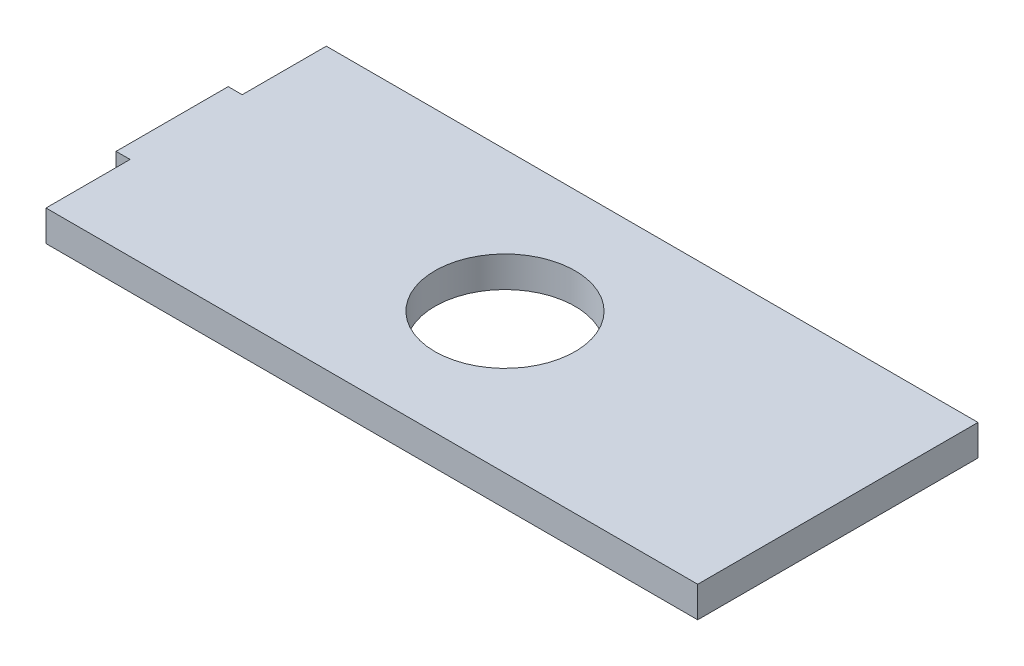
ISO-10303-21;
HEADER;
FILE_DESCRIPTION(('STEP AP214'),'2;1');
FILE_NAME('part.step','',(''),(''),'','','');
FILE_SCHEMA(('AUTOMOTIVE_DESIGN { 1 0 10303 214 1 1 1 1 }'));
ENDSEC;
DATA;
#1=APPLICATION_CONTEXT('core data for automotive mechanical design processes');
#2=APPLICATION_PROTOCOL_DEFINITION('international standard','automotive_design',2000,#1);
#3=PRODUCT_CONTEXT('',#1,'mechanical');
#4=PRODUCT('Part','Part','',(#3));
#5=PRODUCT_RELATED_PRODUCT_CATEGORY('part','',(#4));
#6=PRODUCT_DEFINITION_FORMATION('','',#4);
#7=PRODUCT_DEFINITION_CONTEXT('part definition',#1,'design');
#8=PRODUCT_DEFINITION('design','',#6,#7);
#9=PRODUCT_DEFINITION_SHAPE('','',#8);
#10=(LENGTH_UNIT() NAMED_UNIT(*) SI_UNIT(.MILLI.,.METRE.));
#11=(NAMED_UNIT(*) PLANE_ANGLE_UNIT() SI_UNIT($,.RADIAN.));
#12=(NAMED_UNIT(*) SI_UNIT($,.STERADIAN.) SOLID_ANGLE_UNIT());
#13=UNCERTAINTY_MEASURE_WITH_UNIT(LENGTH_MEASURE(1.E-05),#10,'distance_accuracy_value','');
#14=(GEOMETRIC_REPRESENTATION_CONTEXT(3) GLOBAL_UNCERTAINTY_ASSIGNED_CONTEXT((#13)) GLOBAL_UNIT_ASSIGNED_CONTEXT((#10,
#11,#12)) REPRESENTATION_CONTEXT('',''));
#15=CARTESIAN_POINT('',(0.,0.,0.));
#16=DIRECTION('',(0.,0.,1.));
#17=DIRECTION('',(1.,0.,0.));
#18=AXIS2_PLACEMENT_3D('',#15,#16,#17);
#19=CARTESIAN_POINT('',(-88.6954254312946,2.2,-8.20597529106231E-13));
#20=DIRECTION('',(-1.,0.,0.));
#21=DIRECTION('',(0.,0.,1.));
#22=AXIS2_PLACEMENT_3D('',#19,#20,#21);
#23=PLANE('',#22);
#24=DIRECTION('',(0.,0.,-1.));
#25=VECTOR('',#24,1.);
#26=CARTESIAN_POINT('',(-88.6954254312946,0.,-8.20597529106231E-13));
#27=LINE('',#26,#25);
#28=CARTESIAN_POINT('',(-88.6954254312948,0.,23.1340957614783));
#29=VERTEX_POINT('',#28);
#30=CARTESIAN_POINT('',(-88.6954254312947,0.,17.1340957614361));
#31=VERTEX_POINT('',#30);
#32=EDGE_CURVE('E138',#29,#31,#27,.T.);
#33=ORIENTED_EDGE('',*,*,#32,.F.);
#34=DIRECTION('',(0.,-1.,0.));
#35=VECTOR('',#34,1.);
#36=CARTESIAN_POINT('',(-88.6954254312948,2.2,23.1340957614783));
#37=LINE('',#36,#35);
#38=CARTESIAN_POINT('',(-88.6954254312948,2.2,23.1340957614783));
#39=VERTEX_POINT('',#38);
#40=EDGE_CURVE('E11',#39,#29,#37,.T.);
#41=ORIENTED_EDGE('',*,*,#40,.F.);
#42=DIRECTION('',(0.,0.,-1.));
#43=VECTOR('',#42,1.);
#44=CARTESIAN_POINT('',(-88.6954254312946,2.2,-8.20597529106231E-13));
#45=LINE('',#44,#43);
#46=CARTESIAN_POINT('',(-88.6954254312947,2.2,17.1340957614361));
#47=VERTEX_POINT('',#46);
#48=EDGE_CURVE('E182',#39,#47,#45,.T.);
#49=ORIENTED_EDGE('',*,*,#48,.T.);
#50=DIRECTION('',(0.,-1.,0.));
#51=VECTOR('',#50,1.);
#52=CARTESIAN_POINT('',(-88.6954254312947,2.2,17.1340957614361));
#53=LINE('',#52,#51);
#54=EDGE_CURVE('E89',#47,#31,#53,.T.);
#55=ORIENTED_EDGE('',*,*,#54,.T.);
#56=EDGE_LOOP('',(#33,#41,#49,#55));
#57=FACE_BOUND('',#56,.T.);
#58=ADVANCED_FACE('F37',(#57),#23,.T.);
#59=CARTESIAN_POINT('',(0.,2.2,23.1340957614783));
#60=DIRECTION('',(0.,0.,-1.));
#61=DIRECTION('',(-1.,0.,0.));
#62=AXIS2_PLACEMENT_3D('',#59,#60,#61);
#63=PLANE('',#62);
#64=DIRECTION('',(1.,0.,0.));
#65=VECTOR('',#64,1.);
#66=CARTESIAN_POINT('',(0.,0.,23.1340957614783));
#67=LINE('',#66,#65);
#68=CARTESIAN_POINT('',(-89.6954254312949,0.,23.1340957614783));
#69=VERTEX_POINT('',#68);
#70=EDGE_CURVE('E140',#69,#29,#67,.T.);
#71=ORIENTED_EDGE('',*,*,#70,.F.);
#72=DIRECTION('',(0.,-1.,0.));
#73=VECTOR('',#72,1.);
#74=CARTESIAN_POINT('',(-89.6954254312949,2.2,23.1340957614783));
#75=LINE('',#74,#73);
#76=CARTESIAN_POINT('',(-89.6954254312949,2.2,23.1340957614783));
#77=VERTEX_POINT('',#76);
#78=EDGE_CURVE('E46',#77,#69,#75,.T.);
#79=ORIENTED_EDGE('',*,*,#78,.F.);
#80=DIRECTION('',(1.,0.,0.));
#81=VECTOR('',#80,1.);
#82=CARTESIAN_POINT('',(0.,2.2,23.1340957614783));
#83=LINE('',#82,#81);
#84=EDGE_CURVE('E180',#77,#39,#83,.T.);
#85=ORIENTED_EDGE('',*,*,#84,.T.);
#86=ORIENTED_EDGE('',*,*,#40,.T.);
#87=EDGE_LOOP('',(#71,#79,#85,#86));
#88=FACE_BOUND('',#87,.T.);
#89=ADVANCED_FACE('F173',(#88),#63,.T.);
#90=CARTESIAN_POINT('',(-89.6954254312946,2.2,-9.95819265173723E-13));
#91=DIRECTION('',(-1.,0.,0.));
#92=DIRECTION('',(0.,0.,1.));
#93=AXIS2_PLACEMENT_3D('',#90,#91,#92);
#94=PLANE('',#93);
#95=DIRECTION('',(0.,0.,-1.));
#96=VECTOR('',#95,1.);
#97=CARTESIAN_POINT('',(-89.6954254312946,0.,-9.95819265173723E-13));
#98=LINE('',#97,#96);
#99=CARTESIAN_POINT('',(-89.695425431295,0.,31.1340957614783));
#100=VERTEX_POINT('',#99);
#101=EDGE_CURVE('E143',#100,#69,#98,.T.);
#102=ORIENTED_EDGE('',*,*,#101,.F.);
#103=DIRECTION('',(0.,-1.,0.));
#104=VECTOR('',#103,1.);
#105=CARTESIAN_POINT('',(-89.695425431295,2.2,31.1340957614783));
#106=LINE('',#105,#104);
#107=CARTESIAN_POINT('',(-89.695425431295,2.2,31.1340957614783));
#108=VERTEX_POINT('',#107);
#109=EDGE_CURVE('E162',#108,#100,#106,.T.);
#110=ORIENTED_EDGE('',*,*,#109,.F.);
#111=DIRECTION('',(0.,0.,-1.));
#112=VECTOR('',#111,1.);
#113=CARTESIAN_POINT('',(-89.6954254312946,2.2,-9.95819265173723E-13));
#114=LINE('',#113,#112);
#115=EDGE_CURVE('E169',#108,#77,#114,.T.);
#116=ORIENTED_EDGE('',*,*,#115,.T.);
#117=ORIENTED_EDGE('',*,*,#78,.T.);
#118=EDGE_LOOP('',(#102,#110,#116,#117));
#119=FACE_BOUND('',#118,.T.);
#120=ADVANCED_FACE('F167',(#119),#94,.T.);
#121=CARTESIAN_POINT('',(0.,2.2,31.1340957614783));
#122=DIRECTION('',(0.,0.,1.));
#123=DIRECTION('',(1.,0.,0.));
#124=AXIS2_PLACEMENT_3D('',#121,#122,#123);
#125=PLANE('',#124);
#126=DIRECTION('',(-1.,0.,0.));
#127=VECTOR('',#126,1.);
#128=CARTESIAN_POINT('',(0.,0.,31.1340957614783));
#129=LINE('',#128,#127);
#130=CARTESIAN_POINT('',(-88.695425431295,0.,31.1340957614783));
#131=VERTEX_POINT('',#130);
#132=EDGE_CURVE('E146',#131,#100,#129,.T.);
#133=ORIENTED_EDGE('',*,*,#132,.F.);
#134=DIRECTION('',(0.,-1.,0.));
#135=VECTOR('',#134,1.);
#136=CARTESIAN_POINT('',(-88.695425431295,2.2,31.1340957614783));
#137=LINE('',#136,#135);
#138=CARTESIAN_POINT('',(-88.695425431295,2.2,31.1340957614783));
#139=VERTEX_POINT('',#138);
#140=EDGE_CURVE('E160',#139,#131,#137,.T.);
#141=ORIENTED_EDGE('',*,*,#140,.F.);
#142=DIRECTION('',(-1.,0.,0.));
#143=VECTOR('',#142,1.);
#144=CARTESIAN_POINT('',(0.,2.2,31.1340957614783));
#145=LINE('',#144,#143);
#146=EDGE_CURVE('E130',#139,#108,#145,.T.);
#147=ORIENTED_EDGE('',*,*,#146,.T.);
#148=ORIENTED_EDGE('',*,*,#109,.T.);
#149=EDGE_LOOP('',(#133,#141,#147,#148));
#150=FACE_BOUND('',#149,.T.);
#151=ADVANCED_FACE('F178',(#150),#125,.T.);
#152=CARTESIAN_POINT('',(-88.6954254312947,2.2,-8.20597529106224E-13));
#153=DIRECTION('',(-1.,0.,0.));
#154=DIRECTION('',(0.,0.,1.));
#155=AXIS2_PLACEMENT_3D('',#152,#153,#154);
#156=PLANE('',#155);
#157=DIRECTION('',(0.,0.,-1.));
#158=VECTOR('',#157,1.);
#159=CARTESIAN_POINT('',(-88.6954254312947,0.,-8.20597529106224E-13));
#160=LINE('',#159,#158);
#161=CARTESIAN_POINT('',(-88.695425431295,0.,37.1340957614783));
#162=VERTEX_POINT('',#161);
#163=EDGE_CURVE('E149',#162,#131,#160,.T.);
#164=ORIENTED_EDGE('',*,*,#163,.F.);
#165=DIRECTION('',(0.,-1.,0.));
#166=VECTOR('',#165,1.);
#167=CARTESIAN_POINT('',(-88.695425431295,2.2,37.1340957614783));
#168=LINE('',#167,#166);
#169=CARTESIAN_POINT('',(-88.695425431295,2.2,37.1340957614783));
#170=VERTEX_POINT('',#169);
#171=EDGE_CURVE('E117',#170,#162,#168,.T.);
#172=ORIENTED_EDGE('',*,*,#171,.F.);
#173=DIRECTION('',(0.,0.,-1.));
#174=VECTOR('',#173,1.);
#175=CARTESIAN_POINT('',(-88.6954254312947,2.2,-8.20597529106224E-13));
#176=LINE('',#175,#174);
#177=EDGE_CURVE('E128',#170,#139,#176,.T.);
#178=ORIENTED_EDGE('',*,*,#177,.T.);
#179=ORIENTED_EDGE('',*,*,#140,.T.);
#180=EDGE_LOOP('',(#164,#172,#178,#179));
#181=FACE_BOUND('',#180,.T.);
#182=ADVANCED_FACE('F212',(#181),#156,.T.);
#183=CARTESIAN_POINT('',(0.,2.2,37.1340957614361));
#184=DIRECTION('',(0.,0.,1.));
#185=DIRECTION('',(1.,0.,0.));
#186=AXIS2_PLACEMENT_3D('',#183,#184,#185);
#187=PLANE('',#186);
#188=DIRECTION('',(-1.,0.,0.));
#189=VECTOR('',#188,1.);
#190=CARTESIAN_POINT('',(0.,0.,37.1340957614361));
#191=LINE('',#190,#189);
#192=CARTESIAN_POINT('',(-42.195425431338,0.,37.1340957614448));
#193=VERTEX_POINT('',#192);
#194=EDGE_CURVE('E114',#193,#162,#191,.T.);
#195=ORIENTED_EDGE('',*,*,#194,.F.);
#196=DIRECTION('',(0.,-1.,0.));
#197=VECTOR('',#196,1.);
#198=CARTESIAN_POINT('',(-42.195425431338,2.2,37.1340957614448));
#199=LINE('',#198,#197);
#200=CARTESIAN_POINT('',(-42.195425431338,2.2,37.1340957614448));
#201=VERTEX_POINT('',#200);
#202=EDGE_CURVE('E108',#201,#193,#199,.T.);
#203=ORIENTED_EDGE('',*,*,#202,.F.);
#204=DIRECTION('',(-1.,0.,0.));
#205=VECTOR('',#204,1.);
#206=CARTESIAN_POINT('',(0.,2.2,37.1340957614361));
#207=LINE('',#206,#205);
#208=EDGE_CURVE('E112',#201,#170,#207,.T.);
#209=ORIENTED_EDGE('',*,*,#208,.T.);
#210=ORIENTED_EDGE('',*,*,#171,.T.);
#211=EDGE_LOOP('',(#195,#203,#209,#210));
#212=FACE_BOUND('',#211,.T.);
#213=ADVANCED_FACE('F110',(#212),#187,.T.);
#214=CARTESIAN_POINT('',(-42.195425431338,2.2,0.));
#215=DIRECTION('',(-1.,0.,0.));
#216=DIRECTION('',(0.,0.,1.));
#217=AXIS2_PLACEMENT_3D('',#214,#215,#216);
#218=PLANE('',#217);
#219=DIRECTION('',(0.,0.,-1.));
#220=VECTOR('',#219,1.);
#221=CARTESIAN_POINT('',(-42.195425431338,0.,0.));
#222=LINE('',#221,#220);
#223=CARTESIAN_POINT('',(-42.195425431338,0.,17.1340957614447));
#224=VERTEX_POINT('',#223);
#225=EDGE_CURVE('E153',#193,#224,#222,.T.);
#226=ORIENTED_EDGE('',*,*,#225,.T.);
#227=DIRECTION('',(0.,-1.,0.));
#228=VECTOR('',#227,1.);
#229=CARTESIAN_POINT('',(-42.195425431338,2.2,17.1340957614447));
#230=LINE('',#229,#228);
#231=CARTESIAN_POINT('',(-42.195425431338,2.2,17.1340957614447));
#232=VERTEX_POINT('',#231);
#233=EDGE_CURVE('E118',#232,#224,#230,.T.);
#234=ORIENTED_EDGE('',*,*,#233,.F.);
#235=DIRECTION('',(0.,0.,-1.));
#236=VECTOR('',#235,1.);
#237=CARTESIAN_POINT('',(-42.195425431338,2.2,0.));
#238=LINE('',#237,#236);
#239=EDGE_CURVE('E121',#201,#232,#238,.T.);
#240=ORIENTED_EDGE('',*,*,#239,.F.);
#241=ORIENTED_EDGE('',*,*,#202,.T.);
#242=EDGE_LOOP('',(#226,#234,#240,#241));
#243=FACE_BOUND('',#242,.T.);
#244=ADVANCED_FACE('F122',(#243),#218,.F.);
#245=CARTESIAN_POINT('',(-65.9454254313266,2.2,27.1340957614481));
#246=DIRECTION('',(0.,-1.,0.));
#247=DIRECTION('',(0.,0.,-1.));
#248=AXIS2_PLACEMENT_3D('',#245,#246,#247);
#249=CYLINDRICAL_SURFACE('',#248,4.99999999999998);
#250=CARTESIAN_POINT('',(-65.9454254313266,2.2,27.1340957614481));
#251=DIRECTION('',(0.,1.,0.));
#252=DIRECTION('',(0.,0.,1.));
#253=AXIS2_PLACEMENT_3D('',#250,#251,#252);
#254=CIRCLE('',#253,4.99999999999998);
#255=CARTESIAN_POINT('',(-65.9454254313266,2.2,32.134095761448));
#256=VERTEX_POINT('',#255);
#257=EDGE_CURVE('E156',#256,#256,#254,.T.);
#258=ORIENTED_EDGE('',*,*,#257,.T.);
#259=EDGE_LOOP('',(#258));
#260=FACE_BOUND('',#259,.T.);
#261=CARTESIAN_POINT('',(-65.9454254313266,0.,27.1340957614481));
#262=DIRECTION('',(0.,1.,0.));
#263=DIRECTION('',(0.,0.,1.));
#264=AXIS2_PLACEMENT_3D('',#261,#262,#263);
#265=CIRCLE('',#264,4.99999999999998);
#266=CARTESIAN_POINT('',(-65.9454254313266,0.,32.134095761448));
#267=VERTEX_POINT('',#266);
#268=EDGE_CURVE('E135',#267,#267,#265,.T.);
#269=ORIENTED_EDGE('',*,*,#268,.F.);
#270=EDGE_LOOP('',(#269));
#271=FACE_BOUND('',#270,.T.);
#272=ADVANCED_FACE('F39',(#260,#271),#249,.F.);
#273=CARTESIAN_POINT('',(0.,2.2,17.1340957614361));
#274=DIRECTION('',(0.,0.,1.));
#275=DIRECTION('',(1.,0.,0.));
#276=AXIS2_PLACEMENT_3D('',#273,#274,#275);
#277=PLANE('',#276);
#278=DIRECTION('',(-1.,0.,0.));
#279=VECTOR('',#278,1.);
#280=CARTESIAN_POINT('',(0.,0.,17.1340957614361));
#281=LINE('',#280,#279);
#282=EDGE_CURVE('E82',#224,#31,#281,.T.);
#283=ORIENTED_EDGE('',*,*,#282,.T.);
#284=ORIENTED_EDGE('',*,*,#54,.F.);
#285=DIRECTION('',(-1.,0.,0.));
#286=VECTOR('',#285,1.);
#287=CARTESIAN_POINT('',(0.,2.2,17.1340957614361));
#288=LINE('',#287,#286);
#289=EDGE_CURVE('E54',#232,#47,#288,.T.);
#290=ORIENTED_EDGE('',*,*,#289,.F.);
#291=ORIENTED_EDGE('',*,*,#233,.T.);
#292=EDGE_LOOP('',(#283,#284,#290,#291));
#293=FACE_BOUND('',#292,.T.);
#294=ADVANCED_FACE('F192',(#293),#277,.F.);
#295=CARTESIAN_POINT('',(0.,2.2,0.));
#296=DIRECTION('',(0.,1.,0.));
#297=DIRECTION('',(0.,0.,1.));
#298=AXIS2_PLACEMENT_3D('',#295,#296,#297);
#299=PLANE('',#298);
#300=ORIENTED_EDGE('',*,*,#257,.F.);
#301=EDGE_LOOP('',(#300));
#302=FACE_BOUND('',#301,.T.);
#303=ORIENTED_EDGE('',*,*,#48,.F.);
#304=ORIENTED_EDGE('',*,*,#84,.F.);
#305=ORIENTED_EDGE('',*,*,#115,.F.);
#306=ORIENTED_EDGE('',*,*,#146,.F.);
#307=ORIENTED_EDGE('',*,*,#177,.F.);
#308=ORIENTED_EDGE('',*,*,#208,.F.);
#309=ORIENTED_EDGE('',*,*,#239,.T.);
#310=ORIENTED_EDGE('',*,*,#289,.T.);
#311=EDGE_LOOP('',(#303,#304,#305,#306,#307,#308,#309,#310));
#312=FACE_BOUND('',#311,.T.);
#313=ADVANCED_FACE('F125',(#302,#312),#299,.T.);
#314=CARTESIAN_POINT('',(0.,0.,0.));
#315=DIRECTION('',(0.,1.,0.));
#316=DIRECTION('',(0.,0.,1.));
#317=AXIS2_PLACEMENT_3D('',#314,#315,#316);
#318=PLANE('',#317);
#319=ORIENTED_EDGE('',*,*,#268,.T.);
#320=EDGE_LOOP('',(#319));
#321=FACE_BOUND('',#320,.T.);
#322=ORIENTED_EDGE('',*,*,#32,.T.);
#323=ORIENTED_EDGE('',*,*,#282,.F.);
#324=ORIENTED_EDGE('',*,*,#225,.F.);
#325=ORIENTED_EDGE('',*,*,#194,.T.);
#326=ORIENTED_EDGE('',*,*,#163,.T.);
#327=ORIENTED_EDGE('',*,*,#132,.T.);
#328=ORIENTED_EDGE('',*,*,#101,.T.);
#329=ORIENTED_EDGE('',*,*,#70,.T.);
#330=EDGE_LOOP('',(#322,#323,#324,#325,#326,#327,#328,#329));
#331=FACE_BOUND('',#330,.T.);
#332=ADVANCED_FACE('F174',(#321,#331),#318,.F.);
#333=CLOSED_SHELL('',(#58,#89,#120,#151,#182,#213,#244,#272,#294,#313,#332));
#334=MANIFOLD_SOLID_BREP('B2',#333);
#335=ADVANCED_BREP_SHAPE_REPRESENTATION('',(#18,#334),#14);
#336=SHAPE_DEFINITION_REPRESENTATION(#9,#335);
ENDSEC;
END-ISO-10303-21;
